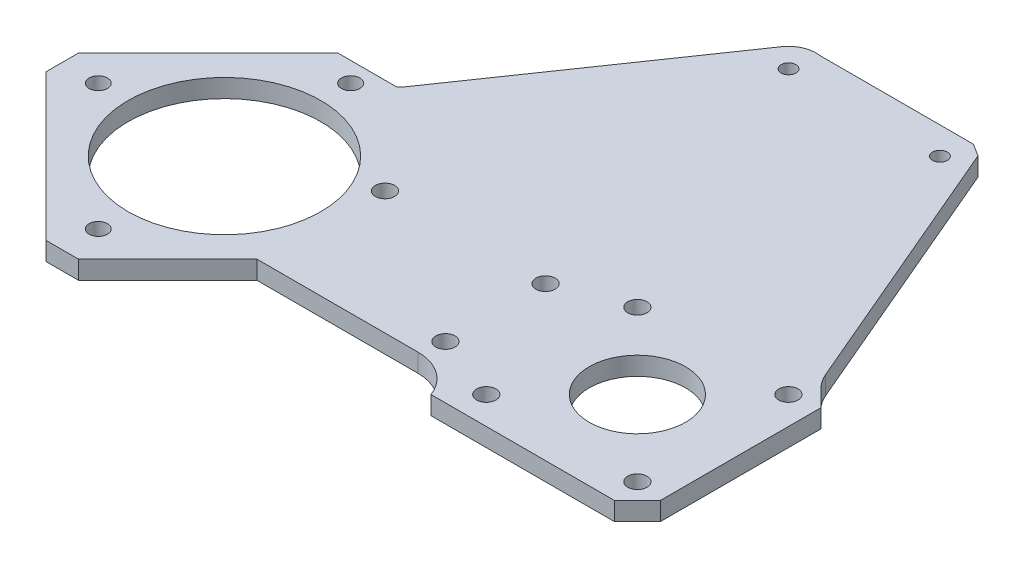
ISO-10303-21;
HEADER;
FILE_DESCRIPTION(('STEP AP214'),'2;1');
FILE_NAME('part.step','',(''),(''),'','','');
FILE_SCHEMA(('AUTOMOTIVE_DESIGN { 1 0 10303 214 1 1 1 1 }'));
ENDSEC;
DATA;
#1=APPLICATION_CONTEXT('core data for automotive mechanical design processes');
#2=APPLICATION_PROTOCOL_DEFINITION('international standard','automotive_design',2000,#1);
#3=PRODUCT_CONTEXT('',#1,'mechanical');
#4=PRODUCT('Part','Part','',(#3));
#5=PRODUCT_RELATED_PRODUCT_CATEGORY('part','',(#4));
#6=PRODUCT_DEFINITION_FORMATION('','',#4);
#7=PRODUCT_DEFINITION_CONTEXT('part definition',#1,'design');
#8=PRODUCT_DEFINITION('design','',#6,#7);
#9=PRODUCT_DEFINITION_SHAPE('','',#8);
#10=(LENGTH_UNIT() NAMED_UNIT(*) SI_UNIT(.MILLI.,.METRE.));
#11=(NAMED_UNIT(*) PLANE_ANGLE_UNIT() SI_UNIT($,.RADIAN.));
#12=(NAMED_UNIT(*) SI_UNIT($,.STERADIAN.) SOLID_ANGLE_UNIT());
#13=UNCERTAINTY_MEASURE_WITH_UNIT(LENGTH_MEASURE(1.E-05),#10,'distance_accuracy_value','');
#14=(GEOMETRIC_REPRESENTATION_CONTEXT(3) GLOBAL_UNCERTAINTY_ASSIGNED_CONTEXT((#13)) GLOBAL_UNIT_ASSIGNED_CONTEXT((#10,
#11,#12)) REPRESENTATION_CONTEXT('',''));
#15=CARTESIAN_POINT('',(0.,0.,0.));
#16=DIRECTION('',(0.,0.,1.));
#17=DIRECTION('',(1.,0.,0.));
#18=AXIS2_PLACEMENT_3D('',#15,#16,#17);
#19=CARTESIAN_POINT('',(15.9099025766975,4.,15.9099025766972));
#20=DIRECTION('',(0.,0.,-1.));
#21=DIRECTION('',(-1.,0.,0.));
#22=AXIS2_PLACEMENT_3D('',#19,#20,#21);
#23=PLANE('',#22);
#24=DIRECTION('',(0.,1.,0.));
#25=VECTOR('',#24,1.);
#26=CARTESIAN_POINT('',(22.980970388563,4.,15.9099025766972));
#27=LINE('',#26,#25);
#28=CARTESIAN_POINT('',(22.980970388563,0.,15.9099025766972));
#29=VERTEX_POINT('',#28);
#30=CARTESIAN_POINT('',(22.980970388563,4.,15.9099025766972));
#31=VERTEX_POINT('',#30);
#32=EDGE_CURVE('E11',#29,#31,#27,.T.);
#33=ORIENTED_EDGE('',*,*,#32,.F.);
#34=DIRECTION('',(1.,0.,0.));
#35=VECTOR('',#34,1.);
#36=CARTESIAN_POINT('',(15.9099025766975,0.,15.9099025766972));
#37=LINE('',#36,#35);
#38=CARTESIAN_POINT('',(58.0993317036803,0.,15.9099025766972));
#39=VERTEX_POINT('',#38);
#40=EDGE_CURVE('E314',#29,#39,#37,.T.);
#41=ORIENTED_EDGE('',*,*,#40,.T.);
#42=DIRECTION('',(0.,1.,0.));
#43=VECTOR('',#42,1.);
#44=CARTESIAN_POINT('',(58.0993317036803,4.,15.9099025766972));
#45=LINE('',#44,#43);
#46=CARTESIAN_POINT('',(58.0993317036803,4.,15.9099025766972));
#47=VERTEX_POINT('',#46);
#48=EDGE_CURVE('E350',#39,#47,#45,.T.);
#49=ORIENTED_EDGE('',*,*,#48,.T.);
#50=DIRECTION('',(1.,0.,0.));
#51=VECTOR('',#50,1.);
#52=CARTESIAN_POINT('',(15.9099025766975,4.,15.9099025766972));
#53=LINE('',#52,#51);
#54=EDGE_CURVE('E317',#31,#47,#53,.T.);
#55=ORIENTED_EDGE('',*,*,#54,.F.);
#56=EDGE_LOOP('',(#33,#41,#49,#55));
#57=FACE_BOUND('',#56,.T.);
#58=ADVANCED_FACE('F39',(#57),#23,.F.);
#59=CARTESIAN_POINT('',(-2.24690353846578,0.,-39.284271247462));
#60=DIRECTION('',(0.,1.,0.));
#61=DIRECTION('',(0.,0.,1.));
#62=AXIS2_PLACEMENT_3D('',#59,#60,#61);
#63=CYLINDRICAL_SURFACE('',#62,11.);
#64=DIRECTION('',(0.,1.,0.));
#65=VECTOR('',#64,1.);
#66=CARTESIAN_POINT('',(5.83280845705235,0.,-31.8198051533947));
#67=LINE('',#66,#65);
#68=CARTESIAN_POINT('',(5.83280845705235,0.,-31.8198051533947));
#69=VERTEX_POINT('',#68);
#70=CARTESIAN_POINT('',(5.83280845705235,4.,-31.8198051533947));
#71=VERTEX_POINT('',#70);
#72=EDGE_CURVE('E224',#69,#71,#67,.T.);
#73=ORIENTED_EDGE('',*,*,#72,.T.);
#74=CARTESIAN_POINT('',(-2.24690353846578,4.,-39.284271247462));
#75=DIRECTION('',(0.,1.,0.));
#76=DIRECTION('',(0.,0.,1.));
#77=AXIS2_PLACEMENT_3D('',#74,#75,#76);
#78=CIRCLE('',#77,11.);
#79=CARTESIAN_POINT('',(6.81409636316551,4.,-33.0474226215422));
#80=VERTEX_POINT('',#79);
#81=EDGE_CURVE('E361',#80,#71,#78,.F.);
#82=ORIENTED_EDGE('',*,*,#81,.F.);
#83=DIRECTION('',(0.,-1.,0.));
#84=VECTOR('',#83,1.);
#85=CARTESIAN_POINT('',(6.81409636316551,4.,-33.0474226215422));
#86=LINE('',#85,#84);
#87=CARTESIAN_POINT('',(6.81409636316551,0.,-33.0474226215422));
#88=VERTEX_POINT('',#87);
#89=EDGE_CURVE('E358',#88,#80,#86,.F.);
#90=ORIENTED_EDGE('',*,*,#89,.F.);
#91=CARTESIAN_POINT('',(-2.24690353846578,0.,-39.284271247462));
#92=DIRECTION('',(0.,1.,0.));
#93=DIRECTION('',(0.,0.,1.));
#94=AXIS2_PLACEMENT_3D('',#91,#92,#93);
#95=CIRCLE('',#94,11.);
#96=EDGE_CURVE('E364',#69,#88,#95,.T.);
#97=ORIENTED_EDGE('',*,*,#96,.F.);
#98=EDGE_LOOP('',(#73,#82,#90,#97));
#99=FACE_BOUND('',#98,.T.);
#100=ADVANCED_FACE('F409',(#99),#63,.F.);
#101=CARTESIAN_POINT('',(0.,4.,0.));
#102=DIRECTION('',(0.,1.,0.));
#103=DIRECTION('',(0.,0.,1.));
#104=AXIS2_PLACEMENT_3D('',#101,#102,#103);
#105=PLANE('',#104);
#106=CARTESIAN_POINT('',(0.,4.,-27.5));
#107=DIRECTION('',(0.,1.,0.));
#108=DIRECTION('',(0.,0.,1.));
#109=AXIS2_PLACEMENT_3D('',#106,#107,#108);
#110=CIRCLE('',#109,2.);
#111=CARTESIAN_POINT('',(0.,4.,-25.5));
#112=VERTEX_POINT('',#111);
#113=EDGE_CURVE('E386',#112,#112,#110,.T.);
#114=ORIENTED_EDGE('',*,*,#113,.F.);
#115=EDGE_LOOP('',(#114));
#116=FACE_BOUND('',#115,.T.);
#117=CARTESIAN_POINT('',(0.,4.,0.));
#118=DIRECTION('',(0.,1.,0.));
#119=DIRECTION('',(0.,0.,1.));
#120=AXIS2_PLACEMENT_3D('',#117,#118,#119);
#121=CIRCLE('',#120,21.);
#122=CARTESIAN_POINT('',(0.,4.,21.));
#123=VERTEX_POINT('',#122);
#124=EDGE_CURVE('E862',#123,#123,#121,.T.);
#125=ORIENTED_EDGE('',*,*,#124,.F.);
#126=EDGE_LOOP('',(#125));
#127=FACE_BOUND('',#126,.T.);
#128=CARTESIAN_POINT('',(-27.5,4.,0.));
#129=DIRECTION('',(0.,1.,0.));
#130=DIRECTION('',(0.,0.,1.));
#131=AXIS2_PLACEMENT_3D('',#128,#129,#130);
#132=CIRCLE('',#131,2.);
#133=CARTESIAN_POINT('',(-27.5,4.,2.00000000000001));
#134=VERTEX_POINT('',#133);
#135=EDGE_CURVE('E855',#134,#134,#132,.T.);
#136=ORIENTED_EDGE('',*,*,#135,.F.);
#137=EDGE_LOOP('',(#136));
#138=FACE_BOUND('',#137,.T.);
#139=CARTESIAN_POINT('',(0.,4.,27.5));
#140=DIRECTION('',(0.,1.,0.));
#141=DIRECTION('',(0.,0.,1.));
#142=AXIS2_PLACEMENT_3D('',#139,#140,#141);
#143=CIRCLE('',#142,2.);
#144=CARTESIAN_POINT('',(0.,4.,29.5));
#145=VERTEX_POINT('',#144);
#146=EDGE_CURVE('E202',#145,#145,#143,.T.);
#147=ORIENTED_EDGE('',*,*,#146,.F.);
#148=EDGE_LOOP('',(#147));
#149=FACE_BOUND('',#148,.T.);
#150=DIRECTION('',(-0.707106781186547,0.,0.707106781186548));
#151=VECTOR('',#150,1.);
#152=CARTESIAN_POINT('',(19.4454364826301,4.,19.4454364826301));
#153=LINE('',#152,#151);
#154=CARTESIAN_POINT('',(3.53553390593105,4.,35.3553390593292));
#155=VERTEX_POINT('',#154);
#156=EDGE_CURVE('E199',#31,#155,#153,.T.);
#157=ORIENTED_EDGE('',*,*,#156,.F.);
#158=ORIENTED_EDGE('',*,*,#54,.T.);
#159=CARTESIAN_POINT('',(58.0993317036803,4.,25.9099025766972));
#160=DIRECTION('',(0.,1.,0.));
#161=DIRECTION('',(0.,0.,1.));
#162=AXIS2_PLACEMENT_3D('',#159,#160,#161);
#163=CIRCLE('',#162,10.);
#164=CARTESIAN_POINT('',(67.5000000000002,4.,22.5000000000002));
#165=VERTEX_POINT('',#164);
#166=EDGE_CURVE('E356',#47,#165,#163,.F.);
#167=ORIENTED_EDGE('',*,*,#166,.T.);
#168=DIRECTION('',(1.,0.,0.));
#169=VECTOR('',#168,1.);
#170=CARTESIAN_POINT('',(67.5000000000002,4.,22.5000000000002));
#171=LINE('',#170,#169);
#172=CARTESIAN_POINT('',(107.5,4.,22.4999999999998));
#173=VERTEX_POINT('',#172);
#174=EDGE_CURVE('E319',#165,#173,#171,.T.);
#175=ORIENTED_EDGE('',*,*,#174,.T.);
#176=DIRECTION('',(-0.707106781186544,0.,0.707106781186551));
#177=VECTOR('',#176,1.);
#178=CARTESIAN_POINT('',(65.0000000000006,4.,64.9999999999999));
#179=LINE('',#178,#177);
#180=CARTESIAN_POINT('',(112.5,4.,17.4999999999998));
#181=VERTEX_POINT('',#180);
#182=EDGE_CURVE('E348',#173,#181,#179,.F.);
#183=ORIENTED_EDGE('',*,*,#182,.T.);
#184=DIRECTION('',(0.,0.,-1.));
#185=VECTOR('',#184,1.);
#186=CARTESIAN_POINT('',(112.5,4.,22.4999999999998));
#187=LINE('',#186,#185);
#188=CARTESIAN_POINT('',(112.5,4.,-17.5000000000002));
#189=VERTEX_POINT('',#188);
#190=EDGE_CURVE('E323',#181,#189,#187,.T.);
#191=ORIENTED_EDGE('',*,*,#190,.T.);
#192=DIRECTION('',(0.707106781186552,0.,0.707106781186543));
#193=VECTOR('',#192,1.);
#194=CARTESIAN_POINT('',(64.9999999999992,4.,-65.0000000000001));
#195=LINE('',#194,#193);
#196=CARTESIAN_POINT('',(108.869228748141,4.,-21.1307712518592));
#197=VERTEX_POINT('',#196);
#198=EDGE_CURVE('E346',#189,#197,#195,.F.);
#199=ORIENTED_EDGE('',*,*,#198,.T.);
#200=CARTESIAN_POINT('',(115.940296560006,4.,-28.2018390637247));
#201=DIRECTION('',(0.,1.,0.));
#202=DIRECTION('',(0.,0.,1.));
#203=AXIS2_PLACEMENT_3D('',#200,#201,#202);
#204=CIRCLE('',#203,10.);
#205=CARTESIAN_POINT('',(106.74084647912,4.,-24.2813648310234));
#206=VERTEX_POINT('',#205);
#207=EDGE_CURVE('E48',#197,#206,#204,.F.);
#208=ORIENTED_EDGE('',*,*,#207,.T.);
#209=DIRECTION('',(-0.392047423270137,0.,-0.919945008088661));
#210=VECTOR('',#209,1.);
#211=CARTESIAN_POINT('',(81.347717681448,4.,-83.8667126502187));
#212=LINE('',#211,#210);
#213=CARTESIAN_POINT('',(82.073615595106,4.,-82.1633825875402));
#214=VERTEX_POINT('',#213);
#215=EDGE_CURVE('E236',#206,#214,#212,.T.);
#216=ORIENTED_EDGE('',*,*,#215,.T.);
#217=DIRECTION('',(0.848048096156427,0.,0.529919264233203));
#218=VECTOR('',#217,1.);
#219=CARTESIAN_POINT('',(59.9714348495174,4.,-95.974357945819));
#220=LINE('',#219,#218);
#221=CARTESIAN_POINT('',(79.347717681448,4.,-83.8667126502187));
#222=VERTEX_POINT('',#221);
#223=EDGE_CURVE('E369',#214,#222,#220,.F.);
#224=ORIENTED_EDGE('',*,*,#223,.T.);
#225=DIRECTION('',(-1.,0.,0.));
#226=VECTOR('',#225,1.);
#227=CARTESIAN_POINT('',(45.949301270352,4.,-83.8667126502187));
#228=LINE('',#227,#226);
#229=CARTESIAN_POINT('',(45.949301270352,4.,-83.8667126502187));
#230=VERTEX_POINT('',#229);
#231=EDGE_CURVE('E242',#222,#230,#228,.T.);
#232=ORIENTED_EDGE('',*,*,#231,.T.);
#233=CARTESIAN_POINT('',(45.,4.,-77.9422863405995));
#234=DIRECTION('',(0.,1.,0.));
#235=DIRECTION('',(0.,0.,1.));
#236=AXIS2_PLACEMENT_3D('',#233,#234,#235);
#237=CIRCLE('',#236,6.);
#238=CARTESIAN_POINT('',(40.057636417292,4.,-81.3442037729194));
#239=VERTEX_POINT('',#238);
#240=EDGE_CURVE('E253',#230,#239,#237,.T.);
#241=ORIENTED_EDGE('',*,*,#240,.T.);
#242=DIRECTION('',(-0.566986238719982,0.,0.823727263784663));
#243=VECTOR('',#242,1.);
#244=CARTESIAN_POINT('',(3.53553390593254,4.,-28.284271247462));
#245=LINE('',#244,#243);
#246=EDGE_CURVE('E259',#239,#80,#245,.T.);
#247=ORIENTED_EDGE('',*,*,#246,.T.);
#248=ORIENTED_EDGE('',*,*,#81,.T.);
#249=DIRECTION('',(1.,0.,0.));
#250=VECTOR('',#249,1.);
#251=CARTESIAN_POINT('',(1.02664151794871E-13,4.,-31.8198051533947));
#252=LINE('',#251,#250);
#253=CARTESIAN_POINT('',(-7.07106781186567,4.,-31.8198051533947));
#254=VERTEX_POINT('',#253);
#255=EDGE_CURVE('E197',#254,#71,#252,.T.);
#256=ORIENTED_EDGE('',*,*,#255,.F.);
#257=DIRECTION('',(-0.70710678118655,0.,0.707106781186545));
#258=VECTOR('',#257,1.);
#259=CARTESIAN_POINT('',(-19.4454364826302,4.,-19.4454364826303));
#260=LINE('',#259,#258);
#261=CARTESIAN_POINT('',(-35.3553390593279,4.,-3.53553390593273));
#262=VERTEX_POINT('',#261);
#263=EDGE_CURVE('E212',#254,#262,#260,.T.);
#264=ORIENTED_EDGE('',*,*,#263,.T.);
#265=DIRECTION('',(0.,0.,1.));
#266=VECTOR('',#265,1.);
#267=CARTESIAN_POINT('',(-35.3553390593279,4.,0.));
#268=LINE('',#267,#266);
#269=CARTESIAN_POINT('',(-35.3553390593279,4.,3.53553390593269));
#270=VERTEX_POINT('',#269);
#271=EDGE_CURVE('E177',#262,#270,#268,.T.);
#272=ORIENTED_EDGE('',*,*,#271,.T.);
#273=DIRECTION('',(-0.707106781186554,0.,-0.707106781186541));
#274=VECTOR('',#273,1.);
#275=CARTESIAN_POINT('',(-19.44543648263,4.,19.4454364826303));
#276=LINE('',#275,#274);
#277=CARTESIAN_POINT('',(-3.53553390593078,4.,35.3553390593292));
#278=VERTEX_POINT('',#277);
#279=EDGE_CURVE('E215',#278,#270,#276,.T.);
#280=ORIENTED_EDGE('',*,*,#279,.F.);
#281=DIRECTION('',(1.,0.,0.));
#282=VECTOR('',#281,1.);
#283=CARTESIAN_POINT('',(6.93889390391102E-13,4.,35.3553390593291));
#284=LINE('',#283,#282);
#285=EDGE_CURVE('E218',#278,#155,#284,.T.);
#286=ORIENTED_EDGE('',*,*,#285,.T.);
#287=EDGE_LOOP('',(#157,#158,#167,#175,#183,#191,#199,#208,#216,#224,#232,#241,#247,#248,#256,
#264,#272,#280,#286));
#288=FACE_BOUND('',#287,.T.);
#289=CARTESIAN_POINT('',(78.,4.,-77.9422863405995));
#290=DIRECTION('',(0.,1.,0.));
#291=DIRECTION('',(0.,0.,1.));
#292=AXIS2_PLACEMENT_3D('',#289,#290,#291);
#293=CIRCLE('',#292,1.60000000000001);
#294=CARTESIAN_POINT('',(78.,4.,-76.3422863405995));
#295=VERTEX_POINT('',#294);
#296=EDGE_CURVE('E223',#295,#295,#293,.T.);
#297=ORIENTED_EDGE('',*,*,#296,.F.);
#298=EDGE_LOOP('',(#297));
#299=FACE_BOUND('',#298,.T.);
#300=CARTESIAN_POINT('',(45.,4.,-77.9422863405995));
#301=DIRECTION('',(0.,1.,0.));
#302=DIRECTION('',(0.,0.,1.));
#303=AXIS2_PLACEMENT_3D('',#300,#301,#302);
#304=CIRCLE('',#303,1.6);
#305=CARTESIAN_POINT('',(45.,4.,-76.3422863405995));
#306=VERTEX_POINT('',#305);
#307=EDGE_CURVE('E249',#306,#306,#304,.T.);
#308=ORIENTED_EDGE('',*,*,#307,.F.);
#309=EDGE_LOOP('',(#308));
#310=FACE_BOUND('',#309,.T.);
#311=CARTESIAN_POINT('',(90.,4.,0.));
#312=DIRECTION('',(0.,1.,0.));
#313=DIRECTION('',(0.,0.,1.));
#314=AXIS2_PLACEMENT_3D('',#311,#312,#313);
#315=CIRCLE('',#314,10.5);
#316=CARTESIAN_POINT('',(90.,4.,10.5));
#317=VERTEX_POINT('',#316);
#318=EDGE_CURVE('E311',#317,#317,#315,.T.);
#319=ORIENTED_EDGE('',*,*,#318,.F.);
#320=EDGE_LOOP('',(#319));
#321=FACE_BOUND('',#320,.T.);
#322=CARTESIAN_POINT('',(106.464466094067,4.,16.4644660940671));
#323=DIRECTION('',(0.,1.,0.));
#324=DIRECTION('',(0.,0.,1.));
#325=AXIS2_PLACEMENT_3D('',#322,#323,#324);
#326=CIRCLE('',#325,2.10000000000003);
#327=CARTESIAN_POINT('',(106.464466094067,4.,18.5644660940672));
#328=VERTEX_POINT('',#327);
#329=EDGE_CURVE('E307',#328,#328,#326,.T.);
#330=ORIENTED_EDGE('',*,*,#329,.F.);
#331=EDGE_LOOP('',(#330));
#332=FACE_BOUND('',#331,.T.);
#333=CARTESIAN_POINT('',(106.464466094067,4.,-16.4644660940674));
#334=DIRECTION('',(0.,1.,0.));
#335=DIRECTION('',(0.,0.,1.));
#336=AXIS2_PLACEMENT_3D('',#333,#334,#335);
#337=CIRCLE('',#336,2.09999999999995);
#338=CARTESIAN_POINT('',(106.464466094067,4.,-14.3644660940674));
#339=VERTEX_POINT('',#338);
#340=EDGE_CURVE('E301',#339,#339,#337,.T.);
#341=ORIENTED_EDGE('',*,*,#340,.F.);
#342=EDGE_LOOP('',(#341));
#343=FACE_BOUND('',#342,.T.);
#344=CARTESIAN_POINT('',(73.5355339059329,4.,-16.4644660940674));
#345=DIRECTION('',(0.,1.,0.));
#346=DIRECTION('',(0.,0.,1.));
#347=AXIS2_PLACEMENT_3D('',#344,#345,#346);
#348=CIRCLE('',#347,2.1);
#349=CARTESIAN_POINT('',(73.5355339059329,4.,-14.3644660940674));
#350=VERTEX_POINT('',#349);
#351=EDGE_CURVE('E295',#350,#350,#348,.T.);
#352=ORIENTED_EDGE('',*,*,#351,.F.);
#353=EDGE_LOOP('',(#352));
#354=FACE_BOUND('',#353,.T.);
#355=CARTESIAN_POINT('',(73.5355339059326,4.,16.4644660940671));
#356=DIRECTION('',(0.,1.,0.));
#357=DIRECTION('',(0.,0.,1.));
#358=AXIS2_PLACEMENT_3D('',#355,#356,#357);
#359=CIRCLE('',#358,2.1);
#360=CARTESIAN_POINT('',(73.5355339059326,4.,18.5644660940671));
#361=VERTEX_POINT('',#360);
#362=EDGE_CURVE('E289',#361,#361,#359,.T.);
#363=ORIENTED_EDGE('',*,*,#362,.F.);
#364=EDGE_LOOP('',(#363));
#365=FACE_BOUND('',#364,.T.);
#366=CARTESIAN_POINT('',(59.0756849520544,4.,10.9099025766972));
#367=DIRECTION('',(0.,1.,0.));
#368=DIRECTION('',(0.,0.,1.));
#369=AXIS2_PLACEMENT_3D('',#366,#367,#368);
#370=CIRCLE('',#369,2.1);
#371=CARTESIAN_POINT('',(59.0756849520544,4.,13.0099025766972));
#372=VERTEX_POINT('',#371);
#373=EDGE_CURVE('E283',#372,#372,#370,.T.);
#374=ORIENTED_EDGE('',*,*,#373,.F.);
#375=EDGE_LOOP('',(#374));
#376=FACE_BOUND('',#375,.T.);
#377=CARTESIAN_POINT('',(59.0756849520543,4.,-10.9099025766974));
#378=DIRECTION('',(0.,1.,0.));
#379=DIRECTION('',(0.,0.,1.));
#380=AXIS2_PLACEMENT_3D('',#377,#378,#379);
#381=CIRCLE('',#380,2.1);
#382=CARTESIAN_POINT('',(59.0756849520543,4.,-8.80990257669744));
#383=VERTEX_POINT('',#382);
#384=EDGE_CURVE('E277',#383,#383,#381,.T.);
#385=ORIENTED_EDGE('',*,*,#384,.F.);
#386=EDGE_LOOP('',(#385));
#387=FACE_BOUND('',#386,.T.);
#388=CARTESIAN_POINT('',(24.0756849520543,4.,-10.9099025766973));
#389=DIRECTION('',(0.,1.,0.));
#390=DIRECTION('',(0.,0.,1.));
#391=AXIS2_PLACEMENT_3D('',#388,#389,#390);
#392=CIRCLE('',#391,2.1);
#393=CARTESIAN_POINT('',(24.0756849520543,4.,-8.80990257669733));
#394=VERTEX_POINT('',#393);
#395=EDGE_CURVE('E271',#394,#394,#392,.T.);
#396=ORIENTED_EDGE('',*,*,#395,.F.);
#397=EDGE_LOOP('',(#396));
#398=FACE_BOUND('',#397,.T.);
#399=ADVANCED_FACE('F415',(#116,#127,#138,#149,#288,#299,#310,#321,#332,#343,#354,#365,#376,
#387,#398),#105,.T.);
#400=CARTESIAN_POINT('',(0.,0.,0.));
#401=DIRECTION('',(0.,1.,0.));
#402=DIRECTION('',(0.,0.,1.));
#403=AXIS2_PLACEMENT_3D('',#400,#401,#402);
#404=PLANE('',#403);
#405=CARTESIAN_POINT('',(0.,0.,-27.5));
#406=DIRECTION('',(0.,1.,0.));
#407=DIRECTION('',(0.,0.,1.));
#408=AXIS2_PLACEMENT_3D('',#405,#406,#407);
#409=CIRCLE('',#408,2.);
#410=CARTESIAN_POINT('',(0.,0.,-25.5));
#411=VERTEX_POINT('',#410);
#412=EDGE_CURVE('E43',#411,#411,#409,.T.);
#413=ORIENTED_EDGE('',*,*,#412,.T.);
#414=EDGE_LOOP('',(#413));
#415=FACE_BOUND('',#414,.T.);
#416=CARTESIAN_POINT('',(0.,0.,0.));
#417=DIRECTION('',(0.,1.,0.));
#418=DIRECTION('',(0.,0.,1.));
#419=AXIS2_PLACEMENT_3D('',#416,#417,#418);
#420=CIRCLE('',#419,21.);
#421=CARTESIAN_POINT('',(0.,0.,21.));
#422=VERTEX_POINT('',#421);
#423=EDGE_CURVE('E388',#422,#422,#420,.T.);
#424=ORIENTED_EDGE('',*,*,#423,.T.);
#425=EDGE_LOOP('',(#424));
#426=FACE_BOUND('',#425,.T.);
#427=CARTESIAN_POINT('',(-27.5,0.,0.));
#428=DIRECTION('',(0.,1.,0.));
#429=DIRECTION('',(0.,0.,1.));
#430=AXIS2_PLACEMENT_3D('',#427,#428,#429);
#431=CIRCLE('',#430,2.);
#432=CARTESIAN_POINT('',(-27.5,0.,2.00000000000001));
#433=VERTEX_POINT('',#432);
#434=EDGE_CURVE('E385',#433,#433,#431,.T.);
#435=ORIENTED_EDGE('',*,*,#434,.T.);
#436=EDGE_LOOP('',(#435));
#437=FACE_BOUND('',#436,.T.);
#438=CARTESIAN_POINT('',(0.,0.,27.5));
#439=DIRECTION('',(0.,1.,0.));
#440=DIRECTION('',(0.,0.,1.));
#441=AXIS2_PLACEMENT_3D('',#438,#439,#440);
#442=CIRCLE('',#441,2.);
#443=CARTESIAN_POINT('',(0.,0.,29.5));
#444=VERTEX_POINT('',#443);
#445=EDGE_CURVE('E382',#444,#444,#442,.T.);
#446=ORIENTED_EDGE('',*,*,#445,.T.);
#447=EDGE_LOOP('',(#446));
#448=FACE_BOUND('',#447,.T.);
#449=DIRECTION('',(1.,0.,0.));
#450=VECTOR('',#449,1.);
#451=CARTESIAN_POINT('',(1.02664151794871E-13,0.,-31.8198051533947));
#452=LINE('',#451,#450);
#453=CARTESIAN_POINT('',(-7.07106781186567,0.,-31.8198051533947));
#454=VERTEX_POINT('',#453);
#455=EDGE_CURVE('E183',#454,#69,#452,.T.);
#456=ORIENTED_EDGE('',*,*,#455,.T.);
#457=ORIENTED_EDGE('',*,*,#96,.T.);
#458=DIRECTION('',(-0.566986238719982,0.,0.823727263784663));
#459=VECTOR('',#458,1.);
#460=CARTESIAN_POINT('',(3.53553390593254,0.,-28.284271247462));
#461=LINE('',#460,#459);
#462=CARTESIAN_POINT('',(40.057636417292,0.,-81.3442037729194));
#463=VERTEX_POINT('',#462);
#464=EDGE_CURVE('E258',#463,#88,#461,.T.);
#465=ORIENTED_EDGE('',*,*,#464,.F.);
#466=CARTESIAN_POINT('',(45.,0.,-77.9422863405995));
#467=DIRECTION('',(0.,1.,0.));
#468=DIRECTION('',(0.,0.,1.));
#469=AXIS2_PLACEMENT_3D('',#466,#467,#468);
#470=CIRCLE('',#469,6.);
#471=CARTESIAN_POINT('',(45.949301270352,0.,-83.8667126502187));
#472=VERTEX_POINT('',#471);
#473=EDGE_CURVE('E256',#472,#463,#470,.T.);
#474=ORIENTED_EDGE('',*,*,#473,.F.);
#475=DIRECTION('',(-1.,0.,0.));
#476=VECTOR('',#475,1.);
#477=CARTESIAN_POINT('',(45.949301270352,0.,-83.8667126502187));
#478=LINE('',#477,#476);
#479=CARTESIAN_POINT('',(79.347717681448,0.,-83.8667126502187));
#480=VERTEX_POINT('',#479);
#481=EDGE_CURVE('E241',#480,#472,#478,.T.);
#482=ORIENTED_EDGE('',*,*,#481,.F.);
#483=DIRECTION('',(-0.848048096156427,0.,-0.529919264233203));
#484=VECTOR('',#483,1.);
#485=CARTESIAN_POINT('',(82.073615595106,0.,-82.1633825875402));
#486=LINE('',#485,#484);
#487=CARTESIAN_POINT('',(82.073615595106,0.,-82.1633825875402));
#488=VERTEX_POINT('',#487);
#489=EDGE_CURVE('E373',#480,#488,#486,.F.);
#490=ORIENTED_EDGE('',*,*,#489,.T.);
#491=DIRECTION('',(-0.392047423270137,0.,-0.919945008088661));
#492=VECTOR('',#491,1.);
#493=CARTESIAN_POINT('',(81.347717681448,0.,-83.8667126502187));
#494=LINE('',#493,#492);
#495=CARTESIAN_POINT('',(106.74084647912,0.,-24.2813648310234));
#496=VERTEX_POINT('',#495);
#497=EDGE_CURVE('E239',#496,#488,#494,.T.);
#498=ORIENTED_EDGE('',*,*,#497,.F.);
#499=CARTESIAN_POINT('',(115.940296560006,0.,-28.2018390637247));
#500=DIRECTION('',(0.,1.,0.));
#501=DIRECTION('',(0.,0.,1.));
#502=AXIS2_PLACEMENT_3D('',#499,#500,#501);
#503=CIRCLE('',#502,10.);
#504=CARTESIAN_POINT('',(108.869228748141,0.,-21.1307712518592));
#505=VERTEX_POINT('',#504);
#506=EDGE_CURVE('E56',#496,#505,#503,.T.);
#507=ORIENTED_EDGE('',*,*,#506,.T.);
#508=DIRECTION('',(-0.707106781186552,0.,-0.707106781186543));
#509=VECTOR('',#508,1.);
#510=CARTESIAN_POINT('',(107.5,0.,-22.5000000000002));
#511=LINE('',#510,#509);
#512=CARTESIAN_POINT('',(112.5,0.,-17.5000000000002));
#513=VERTEX_POINT('',#512);
#514=EDGE_CURVE('E340',#505,#513,#511,.F.);
#515=ORIENTED_EDGE('',*,*,#514,.T.);
#516=DIRECTION('',(0.,0.,-1.));
#517=VECTOR('',#516,1.);
#518=CARTESIAN_POINT('',(112.5,0.,22.4999999999998));
#519=LINE('',#518,#517);
#520=CARTESIAN_POINT('',(112.5,0.,17.4999999999998));
#521=VERTEX_POINT('',#520);
#522=EDGE_CURVE('E320',#521,#513,#519,.T.);
#523=ORIENTED_EDGE('',*,*,#522,.F.);
#524=DIRECTION('',(0.707106781186544,0.,-0.707106781186551));
#525=VECTOR('',#524,1.);
#526=CARTESIAN_POINT('',(112.5,0.,17.4999999999998));
#527=LINE('',#526,#525);
#528=CARTESIAN_POINT('',(107.5,0.,22.4999999999998));
#529=VERTEX_POINT('',#528);
#530=EDGE_CURVE('E342',#521,#529,#527,.F.);
#531=ORIENTED_EDGE('',*,*,#530,.T.);
#532=DIRECTION('',(1.,0.,0.));
#533=VECTOR('',#532,1.);
#534=CARTESIAN_POINT('',(67.5000000000002,0.,22.5000000000002));
#535=LINE('',#534,#533);
#536=CARTESIAN_POINT('',(67.5000000000002,0.,22.5000000000002));
#537=VERTEX_POINT('',#536);
#538=EDGE_CURVE('E328',#537,#529,#535,.T.);
#539=ORIENTED_EDGE('',*,*,#538,.F.);
#540=CARTESIAN_POINT('',(58.0993317036803,0.,25.9099025766972));
#541=DIRECTION('',(0.,1.,0.));
#542=DIRECTION('',(0.,0.,1.));
#543=AXIS2_PLACEMENT_3D('',#540,#541,#542);
#544=CIRCLE('',#543,10.);
#545=EDGE_CURVE('E353',#537,#39,#544,.T.);
#546=ORIENTED_EDGE('',*,*,#545,.T.);
#547=ORIENTED_EDGE('',*,*,#40,.F.);
#548=DIRECTION('',(-0.707106781186547,0.,0.707106781186548));
#549=VECTOR('',#548,1.);
#550=CARTESIAN_POINT('',(19.4454364826301,0.,19.4454364826301));
#551=LINE('',#550,#549);
#552=CARTESIAN_POINT('',(3.53553390593105,0.,35.3553390593292));
#553=VERTEX_POINT('',#552);
#554=EDGE_CURVE('E209',#29,#553,#551,.T.);
#555=ORIENTED_EDGE('',*,*,#554,.T.);
#556=DIRECTION('',(1.,0.,0.));
#557=VECTOR('',#556,1.);
#558=CARTESIAN_POINT('',(6.93889390391102E-13,0.,35.3553390593291));
#559=LINE('',#558,#557);
#560=CARTESIAN_POINT('',(-3.53553390593078,0.,35.3553390593292));
#561=VERTEX_POINT('',#560);
#562=EDGE_CURVE('E206',#561,#553,#559,.T.);
#563=ORIENTED_EDGE('',*,*,#562,.F.);
#564=DIRECTION('',(-0.707106781186554,0.,-0.707106781186541));
#565=VECTOR('',#564,1.);
#566=CARTESIAN_POINT('',(-19.44543648263,0.,19.4454364826303));
#567=LINE('',#566,#565);
#568=CARTESIAN_POINT('',(-35.3553390593279,0.,3.53553390593269));
#569=VERTEX_POINT('',#568);
#570=EDGE_CURVE('E191',#561,#569,#567,.T.);
#571=ORIENTED_EDGE('',*,*,#570,.T.);
#572=DIRECTION('',(0.,0.,1.));
#573=VECTOR('',#572,1.);
#574=CARTESIAN_POINT('',(-35.3553390593279,0.,0.));
#575=LINE('',#574,#573);
#576=CARTESIAN_POINT('',(-35.3553390593279,0.,-3.53553390593273));
#577=VERTEX_POINT('',#576);
#578=EDGE_CURVE('E175',#577,#569,#575,.T.);
#579=ORIENTED_EDGE('',*,*,#578,.F.);
#580=DIRECTION('',(-0.70710678118655,0.,0.707106781186545));
#581=VECTOR('',#580,1.);
#582=CARTESIAN_POINT('',(-19.4454364826302,0.,-19.4454364826303));
#583=LINE('',#582,#581);
#584=EDGE_CURVE('E188',#454,#577,#583,.T.);
#585=ORIENTED_EDGE('',*,*,#584,.F.);
#586=EDGE_LOOP('',(#456,#457,#465,#474,#482,#490,#498,#507,#515,#523,#531,#539,#546,#547,#555,
#563,#571,#579,#585));
#587=FACE_BOUND('',#586,.T.);
#588=CARTESIAN_POINT('',(78.,0.,-77.9422863405995));
#589=DIRECTION('',(0.,1.,0.));
#590=DIRECTION('',(0.,0.,1.));
#591=AXIS2_PLACEMENT_3D('',#588,#589,#590);
#592=CIRCLE('',#591,1.60000000000001);
#593=CARTESIAN_POINT('',(78.,0.,-76.3422863405995));
#594=VERTEX_POINT('',#593);
#595=EDGE_CURVE('E233',#594,#594,#592,.T.);
#596=ORIENTED_EDGE('',*,*,#595,.T.);
#597=EDGE_LOOP('',(#596));
#598=FACE_BOUND('',#597,.T.);
#599=CARTESIAN_POINT('',(45.,0.,-77.9422863405995));
#600=DIRECTION('',(0.,1.,0.));
#601=DIRECTION('',(0.,0.,1.));
#602=AXIS2_PLACEMENT_3D('',#599,#600,#601);
#603=CIRCLE('',#602,1.6);
#604=CARTESIAN_POINT('',(45.,0.,-76.3422863405995));
#605=VERTEX_POINT('',#604);
#606=EDGE_CURVE('E250',#605,#605,#603,.T.);
#607=ORIENTED_EDGE('',*,*,#606,.T.);
#608=EDGE_LOOP('',(#607));
#609=FACE_BOUND('',#608,.T.);
#610=CARTESIAN_POINT('',(90.,0.,0.));
#611=DIRECTION('',(0.,1.,0.));
#612=DIRECTION('',(0.,0.,1.));
#613=AXIS2_PLACEMENT_3D('',#610,#611,#612);
#614=CIRCLE('',#613,10.5);
#615=CARTESIAN_POINT('',(90.,0.,10.5));
#616=VERTEX_POINT('',#615);
#617=EDGE_CURVE('E310',#616,#616,#614,.T.);
#618=ORIENTED_EDGE('',*,*,#617,.T.);
#619=EDGE_LOOP('',(#618));
#620=FACE_BOUND('',#619,.T.);
#621=CARTESIAN_POINT('',(106.464466094067,0.,16.4644660940671));
#622=DIRECTION('',(0.,-1.,0.));
#623=DIRECTION('',(0.,0.,-1.));
#624=AXIS2_PLACEMENT_3D('',#621,#622,#623);
#625=CIRCLE('',#624,2.10000000000003);
#626=CARTESIAN_POINT('',(106.464466094067,0.,14.3644660940671));
#627=VERTEX_POINT('',#626);
#628=EDGE_CURVE('E304',#627,#627,#625,.T.);
#629=ORIENTED_EDGE('',*,*,#628,.F.);
#630=EDGE_LOOP('',(#629));
#631=FACE_BOUND('',#630,.T.);
#632=CARTESIAN_POINT('',(106.464466094067,0.,-16.4644660940674));
#633=DIRECTION('',(0.,-1.,0.));
#634=DIRECTION('',(0.,0.,-1.));
#635=AXIS2_PLACEMENT_3D('',#632,#633,#634);
#636=CIRCLE('',#635,2.09999999999995);
#637=CARTESIAN_POINT('',(106.464466094067,0.,-18.5644660940673));
#638=VERTEX_POINT('',#637);
#639=EDGE_CURVE('E298',#638,#638,#636,.T.);
#640=ORIENTED_EDGE('',*,*,#639,.F.);
#641=EDGE_LOOP('',(#640));
#642=FACE_BOUND('',#641,.T.);
#643=CARTESIAN_POINT('',(73.5355339059329,0.,-16.4644660940674));
#644=DIRECTION('',(0.,-1.,0.));
#645=DIRECTION('',(0.,0.,1.));
#646=AXIS2_PLACEMENT_3D('',#643,#644,#645);
#647=CIRCLE('',#646,2.1);
#648=CARTESIAN_POINT('',(73.5355339059329,0.,-14.3644660940674));
#649=VERTEX_POINT('',#648);
#650=EDGE_CURVE('E292',#649,#649,#647,.T.);
#651=ORIENTED_EDGE('',*,*,#650,.F.);
#652=EDGE_LOOP('',(#651));
#653=FACE_BOUND('',#652,.T.);
#654=CARTESIAN_POINT('',(73.5355339059326,0.,16.4644660940671));
#655=DIRECTION('',(0.,-1.,0.));
#656=DIRECTION('',(0.,0.,1.));
#657=AXIS2_PLACEMENT_3D('',#654,#655,#656);
#658=CIRCLE('',#657,2.1);
#659=CARTESIAN_POINT('',(73.5355339059326,0.,18.5644660940671));
#660=VERTEX_POINT('',#659);
#661=EDGE_CURVE('E286',#660,#660,#658,.T.);
#662=ORIENTED_EDGE('',*,*,#661,.F.);
#663=EDGE_LOOP('',(#662));
#664=FACE_BOUND('',#663,.T.);
#665=CARTESIAN_POINT('',(59.0756849520544,0.,10.9099025766972));
#666=DIRECTION('',(0.,-1.,0.));
#667=DIRECTION('',(0.,0.,-1.));
#668=AXIS2_PLACEMENT_3D('',#665,#666,#667);
#669=CIRCLE('',#668,2.1);
#670=CARTESIAN_POINT('',(59.0756849520544,0.,8.80990257669725));
#671=VERTEX_POINT('',#670);
#672=EDGE_CURVE('E280',#671,#671,#669,.T.);
#673=ORIENTED_EDGE('',*,*,#672,.F.);
#674=EDGE_LOOP('',(#673));
#675=FACE_BOUND('',#674,.T.);
#676=CARTESIAN_POINT('',(59.0756849520543,0.,-10.9099025766974));
#677=DIRECTION('',(0.,-1.,0.));
#678=DIRECTION('',(0.,0.,1.));
#679=AXIS2_PLACEMENT_3D('',#676,#677,#678);
#680=CIRCLE('',#679,2.1);
#681=CARTESIAN_POINT('',(59.0756849520543,0.,-8.80990257669744));
#682=VERTEX_POINT('',#681);
#683=EDGE_CURVE('E274',#682,#682,#680,.T.);
#684=ORIENTED_EDGE('',*,*,#683,.F.);
#685=EDGE_LOOP('',(#684));
#686=FACE_BOUND('',#685,.T.);
#687=CARTESIAN_POINT('',(24.0756849520543,0.,-10.9099025766973));
#688=DIRECTION('',(0.,-1.,0.));
#689=DIRECTION('',(0.,0.,1.));
#690=AXIS2_PLACEMENT_3D('',#687,#688,#689);
#691=CIRCLE('',#690,2.1);
#692=CARTESIAN_POINT('',(24.0756849520543,0.,-8.80990257669733));
#693=VERTEX_POINT('',#692);
#694=EDGE_CURVE('E268',#693,#693,#691,.T.);
#695=ORIENTED_EDGE('',*,*,#694,.F.);
#696=EDGE_LOOP('',(#695));
#697=FACE_BOUND('',#696,.T.);
#698=ADVANCED_FACE('F186',(#415,#426,#437,#448,#587,#598,#609,#620,#631,#642,#653,#664,#675,
#686,#697),#404,.F.);
#699=CARTESIAN_POINT('',(67.5000000000002,4.,22.5000000000002));
#700=DIRECTION('',(0.,0.,-1.));
#701=DIRECTION('',(-1.,0.,0.));
#702=AXIS2_PLACEMENT_3D('',#699,#700,#701);
#703=PLANE('',#702);
#704=ORIENTED_EDGE('',*,*,#538,.T.);
#705=DIRECTION('',(0.,1.,0.));
#706=VECTOR('',#705,1.);
#707=CARTESIAN_POINT('',(107.5,4.,22.4999999999998));
#708=LINE('',#707,#706);
#709=EDGE_CURVE('E344',#529,#173,#708,.T.);
#710=ORIENTED_EDGE('',*,*,#709,.T.);
#711=ORIENTED_EDGE('',*,*,#174,.F.);
#712=DIRECTION('',(0.,-1.,0.));
#713=VECTOR('',#712,1.);
#714=CARTESIAN_POINT('',(67.5000000000002,4.,22.5000000000002));
#715=LINE('',#714,#713);
#716=EDGE_CURVE('E326',#165,#537,#715,.T.);
#717=ORIENTED_EDGE('',*,*,#716,.T.);
#718=EDGE_LOOP('',(#704,#710,#711,#717));
#719=FACE_BOUND('',#718,.T.);
#720=ADVANCED_FACE('F421',(#719),#703,.F.);
#721=CARTESIAN_POINT('',(112.5,4.,22.4999999999998));
#722=DIRECTION('',(-1.,0.,0.));
#723=DIRECTION('',(0.,0.,1.));
#724=AXIS2_PLACEMENT_3D('',#721,#722,#723);
#725=PLANE('',#724);
#726=ORIENTED_EDGE('',*,*,#190,.F.);
#727=DIRECTION('',(0.,-1.,0.));
#728=VECTOR('',#727,1.);
#729=CARTESIAN_POINT('',(112.5,4.,17.4999999999998));
#730=LINE('',#729,#728);
#731=EDGE_CURVE('E337',#181,#521,#730,.T.);
#732=ORIENTED_EDGE('',*,*,#731,.T.);
#733=ORIENTED_EDGE('',*,*,#522,.T.);
#734=DIRECTION('',(0.,1.,0.));
#735=VECTOR('',#734,1.);
#736=CARTESIAN_POINT('',(112.5,4.,-17.5000000000002));
#737=LINE('',#736,#735);
#738=EDGE_CURVE('E335',#513,#189,#737,.T.);
#739=ORIENTED_EDGE('',*,*,#738,.T.);
#740=EDGE_LOOP('',(#726,#732,#733,#739));
#741=FACE_BOUND('',#740,.T.);
#742=ADVANCED_FACE('F473',(#741),#725,.F.);
#743=CARTESIAN_POINT('',(90.,4.,0.));
#744=DIRECTION('',(0.,-1.,0.));
#745=DIRECTION('',(0.,0.,-1.));
#746=AXIS2_PLACEMENT_3D('',#743,#744,#745);
#747=CYLINDRICAL_SURFACE('',#746,10.5);
#748=ORIENTED_EDGE('',*,*,#318,.T.);
#749=EDGE_LOOP('',(#748));
#750=FACE_BOUND('',#749,.T.);
#751=ORIENTED_EDGE('',*,*,#617,.F.);
#752=EDGE_LOOP('',(#751));
#753=FACE_BOUND('',#752,.T.);
#754=ADVANCED_FACE('F427',(#750,#753),#747,.F.);
#755=CARTESIAN_POINT('',(112.5,4.,17.4999999999998));
#756=DIRECTION('',(-0.707106781186551,0.,-0.707106781186543));
#757=DIRECTION('',(0.,-1.,0.));
#758=AXIS2_PLACEMENT_3D('',#755,#756,#757);
#759=PLANE('',#758);
#760=ORIENTED_EDGE('',*,*,#182,.F.);
#761=ORIENTED_EDGE('',*,*,#709,.F.);
#762=ORIENTED_EDGE('',*,*,#530,.F.);
#763=ORIENTED_EDGE('',*,*,#731,.F.);
#764=EDGE_LOOP('',(#760,#761,#762,#763));
#765=FACE_BOUND('',#764,.T.);
#766=ADVANCED_FACE('F423',(#765),#759,.F.);
#767=CARTESIAN_POINT('',(107.5,4.,-22.5000000000002));
#768=DIRECTION('',(-0.707106781186543,0.,0.707106781186552));
#769=DIRECTION('',(0.,-1.,0.));
#770=AXIS2_PLACEMENT_3D('',#767,#768,#769);
#771=PLANE('',#770);
#772=ORIENTED_EDGE('',*,*,#514,.F.);
#773=DIRECTION('',(0.,-1.,0.));
#774=VECTOR('',#773,1.);
#775=CARTESIAN_POINT('',(108.869228748141,4.,-21.1307712518592));
#776=LINE('',#775,#774);
#777=EDGE_CURVE('E63',#505,#197,#776,.F.);
#778=ORIENTED_EDGE('',*,*,#777,.T.);
#779=ORIENTED_EDGE('',*,*,#198,.F.);
#780=ORIENTED_EDGE('',*,*,#738,.F.);
#781=EDGE_LOOP('',(#772,#778,#779,#780));
#782=FACE_BOUND('',#781,.T.);
#783=ADVANCED_FACE('F426',(#782),#771,.F.);
#784=CARTESIAN_POINT('',(58.0993317036803,4.,25.9099025766972));
#785=DIRECTION('',(0.,1.,0.));
#786=DIRECTION('',(0.,0.,1.));
#787=AXIS2_PLACEMENT_3D('',#784,#785,#786);
#788=CYLINDRICAL_SURFACE('',#787,10.);
#789=ORIENTED_EDGE('',*,*,#166,.F.);
#790=ORIENTED_EDGE('',*,*,#48,.F.);
#791=ORIENTED_EDGE('',*,*,#545,.F.);
#792=ORIENTED_EDGE('',*,*,#716,.F.);
#793=EDGE_LOOP('',(#789,#790,#791,#792));
#794=FACE_BOUND('',#793,.T.);
#795=ADVANCED_FACE('F431',(#794),#788,.F.);
#796=CARTESIAN_POINT('',(106.464466094067,10.,16.4644660940671));
#797=DIRECTION('',(0.,-1.,0.));
#798=DIRECTION('',(0.,0.,-1.));
#799=AXIS2_PLACEMENT_3D('',#796,#797,#798);
#800=CYLINDRICAL_SURFACE('',#799,2.10000000000003);
#801=ORIENTED_EDGE('',*,*,#329,.T.);
#802=EDGE_LOOP('',(#801));
#803=FACE_BOUND('',#802,.T.);
#804=ORIENTED_EDGE('',*,*,#628,.T.);
#805=EDGE_LOOP('',(#804));
#806=FACE_BOUND('',#805,.T.);
#807=ADVANCED_FACE('F433',(#803,#806),#800,.F.);
#808=CARTESIAN_POINT('',(106.464466094067,10.,-16.4644660940674));
#809=DIRECTION('',(0.,-1.,0.));
#810=DIRECTION('',(0.,0.,-1.));
#811=AXIS2_PLACEMENT_3D('',#808,#809,#810);
#812=CYLINDRICAL_SURFACE('',#811,2.09999999999995);
#813=ORIENTED_EDGE('',*,*,#340,.T.);
#814=EDGE_LOOP('',(#813));
#815=FACE_BOUND('',#814,.T.);
#816=ORIENTED_EDGE('',*,*,#639,.T.);
#817=EDGE_LOOP('',(#816));
#818=FACE_BOUND('',#817,.T.);
#819=ADVANCED_FACE('F532',(#815,#818),#812,.F.);
#820=CARTESIAN_POINT('',(73.5355339059329,10.,-16.4644660940674));
#821=DIRECTION('',(0.,-1.,0.));
#822=DIRECTION('',(0.,0.,-1.));
#823=AXIS2_PLACEMENT_3D('',#820,#821,#822);
#824=CYLINDRICAL_SURFACE('',#823,2.1);
#825=ORIENTED_EDGE('',*,*,#351,.T.);
#826=EDGE_LOOP('',(#825));
#827=FACE_BOUND('',#826,.T.);
#828=ORIENTED_EDGE('',*,*,#650,.T.);
#829=EDGE_LOOP('',(#828));
#830=FACE_BOUND('',#829,.T.);
#831=ADVANCED_FACE('F528',(#827,#830),#824,.F.);
#832=CARTESIAN_POINT('',(73.5355339059326,10.,16.4644660940671));
#833=DIRECTION('',(0.,-1.,0.));
#834=DIRECTION('',(0.,0.,-1.));
#835=AXIS2_PLACEMENT_3D('',#832,#833,#834);
#836=CYLINDRICAL_SURFACE('',#835,2.1);
#837=ORIENTED_EDGE('',*,*,#362,.T.);
#838=EDGE_LOOP('',(#837));
#839=FACE_BOUND('',#838,.T.);
#840=ORIENTED_EDGE('',*,*,#661,.T.);
#841=EDGE_LOOP('',(#840));
#842=FACE_BOUND('',#841,.T.);
#843=ADVANCED_FACE('F524',(#839,#842),#836,.F.);
#844=CARTESIAN_POINT('',(59.0756849520544,10.,10.9099025766972));
#845=DIRECTION('',(0.,-1.,0.));
#846=DIRECTION('',(0.,0.,-1.));
#847=AXIS2_PLACEMENT_3D('',#844,#845,#846);
#848=CYLINDRICAL_SURFACE('',#847,2.1);
#849=ORIENTED_EDGE('',*,*,#373,.T.);
#850=EDGE_LOOP('',(#849));
#851=FACE_BOUND('',#850,.T.);
#852=ORIENTED_EDGE('',*,*,#672,.T.);
#853=EDGE_LOOP('',(#852));
#854=FACE_BOUND('',#853,.T.);
#855=ADVANCED_FACE('F520',(#851,#854),#848,.F.);
#856=CARTESIAN_POINT('',(59.0756849520543,10.,-10.9099025766974));
#857=DIRECTION('',(0.,-1.,0.));
#858=DIRECTION('',(0.,0.,-1.));
#859=AXIS2_PLACEMENT_3D('',#856,#857,#858);
#860=CYLINDRICAL_SURFACE('',#859,2.1);
#861=ORIENTED_EDGE('',*,*,#384,.T.);
#862=EDGE_LOOP('',(#861));
#863=FACE_BOUND('',#862,.T.);
#864=ORIENTED_EDGE('',*,*,#683,.T.);
#865=EDGE_LOOP('',(#864));
#866=FACE_BOUND('',#865,.T.);
#867=ADVANCED_FACE('F512',(#863,#866),#860,.F.);
#868=CARTESIAN_POINT('',(24.0756849520543,10.,-10.9099025766973));
#869=DIRECTION('',(0.,-1.,0.));
#870=DIRECTION('',(0.,0.,-1.));
#871=AXIS2_PLACEMENT_3D('',#868,#869,#870);
#872=CYLINDRICAL_SURFACE('',#871,2.1);
#873=ORIENTED_EDGE('',*,*,#395,.T.);
#874=EDGE_LOOP('',(#873));
#875=FACE_BOUND('',#874,.T.);
#876=ORIENTED_EDGE('',*,*,#694,.T.);
#877=EDGE_LOOP('',(#876));
#878=FACE_BOUND('',#877,.T.);
#879=ADVANCED_FACE('F504',(#875,#878),#872,.F.);
#880=CARTESIAN_POINT('',(3.53553390593254,0.,-28.284271247462));
#881=DIRECTION('',(-0.823727263784663,0.,-0.566986238719982));
#882=DIRECTION('',(-0.566986238719982,0.,0.823727263784663));
#883=AXIS2_PLACEMENT_3D('',#880,#881,#882);
#884=PLANE('',#883);
#885=ORIENTED_EDGE('',*,*,#464,.T.);
#886=ORIENTED_EDGE('',*,*,#89,.T.);
#887=ORIENTED_EDGE('',*,*,#246,.F.);
#888=DIRECTION('',(0.,1.,0.));
#889=VECTOR('',#888,1.);
#890=CARTESIAN_POINT('',(40.057636417292,0.,-81.3442037729194));
#891=LINE('',#890,#889);
#892=EDGE_CURVE('E262',#463,#239,#891,.T.);
#893=ORIENTED_EDGE('',*,*,#892,.F.);
#894=EDGE_LOOP('',(#885,#886,#887,#893));
#895=FACE_BOUND('',#894,.T.);
#896=ADVANCED_FACE('F502',(#895),#884,.T.);
#897=CARTESIAN_POINT('',(45.,0.,-77.9422863405995));
#898=DIRECTION('',(0.,1.,0.));
#899=DIRECTION('',(0.,0.,1.));
#900=AXIS2_PLACEMENT_3D('',#897,#898,#899);
#901=CYLINDRICAL_SURFACE('',#900,6.);
#902=DIRECTION('',(0.,1.,0.));
#903=VECTOR('',#902,1.);
#904=CARTESIAN_POINT('',(45.949301270352,0.,-83.8667126502187));
#905=LINE('',#904,#903);
#906=EDGE_CURVE('E244',#472,#230,#905,.T.);
#907=ORIENTED_EDGE('',*,*,#906,.F.);
#908=ORIENTED_EDGE('',*,*,#473,.T.);
#909=ORIENTED_EDGE('',*,*,#892,.T.);
#910=ORIENTED_EDGE('',*,*,#240,.F.);
#911=EDGE_LOOP('',(#907,#908,#909,#910));
#912=FACE_BOUND('',#911,.T.);
#913=ADVANCED_FACE('F460',(#912),#901,.T.);
#914=CARTESIAN_POINT('',(45.,0.,-77.9422863405995));
#915=DIRECTION('',(0.,1.,0.));
#916=DIRECTION('',(0.,0.,1.));
#917=AXIS2_PLACEMENT_3D('',#914,#915,#916);
#918=CYLINDRICAL_SURFACE('',#917,1.6);
#919=ORIENTED_EDGE('',*,*,#606,.F.);
#920=EDGE_LOOP('',(#919));
#921=FACE_BOUND('',#920,.T.);
#922=ORIENTED_EDGE('',*,*,#307,.T.);
#923=EDGE_LOOP('',(#922));
#924=FACE_BOUND('',#923,.T.);
#925=ADVANCED_FACE('F510',(#921,#924),#918,.F.);
#926=CARTESIAN_POINT('',(45.949301270352,0.,-83.8667126502187));
#927=DIRECTION('',(0.,0.,-1.));
#928=DIRECTION('',(-1.,0.,0.));
#929=AXIS2_PLACEMENT_3D('',#926,#927,#928);
#930=PLANE('',#929);
#931=ORIENTED_EDGE('',*,*,#231,.F.);
#932=DIRECTION('',(0.,-1.,0.));
#933=VECTOR('',#932,1.);
#934=CARTESIAN_POINT('',(79.347717681448,0.,-83.8667126502187));
#935=LINE('',#934,#933);
#936=EDGE_CURVE('E371',#222,#480,#935,.T.);
#937=ORIENTED_EDGE('',*,*,#936,.T.);
#938=ORIENTED_EDGE('',*,*,#481,.T.);
#939=ORIENTED_EDGE('',*,*,#906,.T.);
#940=EDGE_LOOP('',(#931,#937,#938,#939));
#941=FACE_BOUND('',#940,.T.);
#942=ADVANCED_FACE('F457',(#941),#930,.T.);
#943=CARTESIAN_POINT('',(81.347717681448,0.,-83.8667126502187));
#944=DIRECTION('',(0.919945008088661,0.,-0.392047423270137));
#945=DIRECTION('',(-0.392047423270137,0.,-0.919945008088661));
#946=AXIS2_PLACEMENT_3D('',#943,#944,#945);
#947=PLANE('',#946);
#948=ORIENTED_EDGE('',*,*,#215,.F.);
#949=DIRECTION('',(0.,1.,0.));
#950=VECTOR('',#949,1.);
#951=CARTESIAN_POINT('',(106.74084647912,0.,-24.2813648310234));
#952=LINE('',#951,#950);
#953=EDGE_CURVE('E376',#206,#496,#952,.F.);
#954=ORIENTED_EDGE('',*,*,#953,.T.);
#955=ORIENTED_EDGE('',*,*,#497,.T.);
#956=DIRECTION('',(0.,1.,0.));
#957=VECTOR('',#956,1.);
#958=CARTESIAN_POINT('',(82.073615595106,0.,-82.1633825875402));
#959=LINE('',#958,#957);
#960=EDGE_CURVE('E366',#488,#214,#959,.T.);
#961=ORIENTED_EDGE('',*,*,#960,.T.);
#962=EDGE_LOOP('',(#948,#954,#955,#961));
#963=FACE_BOUND('',#962,.T.);
#964=ADVANCED_FACE('F444',(#963),#947,.T.);
#965=CARTESIAN_POINT('',(78.,0.,-77.9422863405995));
#966=DIRECTION('',(0.,1.,0.));
#967=DIRECTION('',(0.,0.,1.));
#968=AXIS2_PLACEMENT_3D('',#965,#966,#967);
#969=CYLINDRICAL_SURFACE('',#968,1.60000000000001);
#970=ORIENTED_EDGE('',*,*,#595,.F.);
#971=EDGE_LOOP('',(#970));
#972=FACE_BOUND('',#971,.T.);
#973=ORIENTED_EDGE('',*,*,#296,.T.);
#974=EDGE_LOOP('',(#973));
#975=FACE_BOUND('',#974,.T.);
#976=ADVANCED_FACE('F437',(#972,#975),#969,.F.);
#977=CARTESIAN_POINT('',(82.073615595106,0.,-82.1633825875402));
#978=DIRECTION('',(-0.529919264233203,0.,0.848048096156427));
#979=DIRECTION('',(0.,1.,0.));
#980=AXIS2_PLACEMENT_3D('',#977,#978,#979);
#981=PLANE('',#980);
#982=ORIENTED_EDGE('',*,*,#489,.F.);
#983=ORIENTED_EDGE('',*,*,#936,.F.);
#984=ORIENTED_EDGE('',*,*,#223,.F.);
#985=ORIENTED_EDGE('',*,*,#960,.F.);
#986=EDGE_LOOP('',(#982,#983,#984,#985));
#987=FACE_BOUND('',#986,.T.);
#988=ADVANCED_FACE('F435',(#987),#981,.F.);
#989=CARTESIAN_POINT('',(115.940296560006,0.,-28.2018390637247));
#990=DIRECTION('',(0.,-1.,0.));
#991=DIRECTION('',(0.,0.,-1.));
#992=AXIS2_PLACEMENT_3D('',#989,#990,#991);
#993=CYLINDRICAL_SURFACE('',#992,10.);
#994=ORIENTED_EDGE('',*,*,#207,.F.);
#995=ORIENTED_EDGE('',*,*,#777,.F.);
#996=ORIENTED_EDGE('',*,*,#506,.F.);
#997=ORIENTED_EDGE('',*,*,#953,.F.);
#998=EDGE_LOOP('',(#994,#995,#996,#997));
#999=FACE_BOUND('',#998,.T.);
#1000=ADVANCED_FACE('F41',(#999),#993,.F.);
#1001=CARTESIAN_POINT('',(-35.3553390593279,0.,0.));
#1002=DIRECTION('',(-1.,0.,0.));
#1003=DIRECTION('',(0.,0.,1.));
#1004=AXIS2_PLACEMENT_3D('',#1001,#1002,#1003);
#1005=PLANE('',#1004);
#1006=ORIENTED_EDGE('',*,*,#271,.F.);
#1007=DIRECTION('',(0.,1.,0.));
#1008=VECTOR('',#1007,1.);
#1009=CARTESIAN_POINT('',(-35.3553390593279,0.,-3.53553390593273));
#1010=LINE('',#1009,#1008);
#1011=EDGE_CURVE('E172',#577,#262,#1010,.T.);
#1012=ORIENTED_EDGE('',*,*,#1011,.F.);
#1013=ORIENTED_EDGE('',*,*,#578,.T.);
#1014=DIRECTION('',(0.,1.,0.));
#1015=VECTOR('',#1014,1.);
#1016=CARTESIAN_POINT('',(-35.3553390593279,0.,3.53553390593269));
#1017=LINE('',#1016,#1015);
#1018=EDGE_CURVE('E182',#569,#270,#1017,.T.);
#1019=ORIENTED_EDGE('',*,*,#1018,.T.);
#1020=EDGE_LOOP('',(#1006,#1012,#1013,#1019));
#1021=FACE_BOUND('',#1020,.T.);
#1022=ADVANCED_FACE('F174',(#1021),#1005,.T.);
#1023=CARTESIAN_POINT('',(-19.44543648263,0.,19.4454364826303));
#1024=DIRECTION('',(0.707106781186541,0.,-0.707106781186554));
#1025=DIRECTION('',(-0.707106781186554,0.,-0.707106781186541));
#1026=AXIS2_PLACEMENT_3D('',#1023,#1024,#1025);
#1027=PLANE('',#1026);
#1028=ORIENTED_EDGE('',*,*,#279,.T.);
#1029=ORIENTED_EDGE('',*,*,#1018,.F.);
#1030=ORIENTED_EDGE('',*,*,#570,.F.);
#1031=DIRECTION('',(0.,1.,0.));
#1032=VECTOR('',#1031,1.);
#1033=CARTESIAN_POINT('',(-3.53553390593078,0.,35.3553390593292));
#1034=LINE('',#1033,#1032);
#1035=EDGE_CURVE('E230',#561,#278,#1034,.T.);
#1036=ORIENTED_EDGE('',*,*,#1035,.T.);
#1037=EDGE_LOOP('',(#1028,#1029,#1030,#1036));
#1038=FACE_BOUND('',#1037,.T.);
#1039=ADVANCED_FACE('F494',(#1038),#1027,.F.);
#1040=CARTESIAN_POINT('',(6.93889390391102E-13,0.,35.3553390593291));
#1041=DIRECTION('',(0.,0.,1.));
#1042=DIRECTION('',(1.,0.,0.));
#1043=AXIS2_PLACEMENT_3D('',#1040,#1041,#1042);
#1044=PLANE('',#1043);
#1045=ORIENTED_EDGE('',*,*,#285,.F.);
#1046=ORIENTED_EDGE('',*,*,#1035,.F.);
#1047=ORIENTED_EDGE('',*,*,#562,.T.);
#1048=DIRECTION('',(0.,1.,0.));
#1049=VECTOR('',#1048,1.);
#1050=CARTESIAN_POINT('',(3.53553390593105,0.,35.3553390593292));
#1051=LINE('',#1050,#1049);
#1052=EDGE_CURVE('E227',#553,#155,#1051,.T.);
#1053=ORIENTED_EDGE('',*,*,#1052,.T.);
#1054=EDGE_LOOP('',(#1045,#1046,#1047,#1053));
#1055=FACE_BOUND('',#1054,.T.);
#1056=ADVANCED_FACE('F492',(#1055),#1044,.T.);
#1057=CARTESIAN_POINT('',(1.02664151794871E-13,0.,-31.8198051533947));
#1058=DIRECTION('',(0.,0.,1.));
#1059=DIRECTION('',(1.,0.,0.));
#1060=AXIS2_PLACEMENT_3D('',#1057,#1058,#1059);
#1061=PLANE('',#1060);
#1062=ORIENTED_EDGE('',*,*,#255,.T.);
#1063=ORIENTED_EDGE('',*,*,#72,.F.);
#1064=ORIENTED_EDGE('',*,*,#455,.F.);
#1065=DIRECTION('',(0.,1.,0.));
#1066=VECTOR('',#1065,1.);
#1067=CARTESIAN_POINT('',(-7.07106781186567,0.,-31.8198051533947));
#1068=LINE('',#1067,#1066);
#1069=EDGE_CURVE('E195',#454,#254,#1068,.T.);
#1070=ORIENTED_EDGE('',*,*,#1069,.T.);
#1071=EDGE_LOOP('',(#1062,#1063,#1064,#1070));
#1072=FACE_BOUND('',#1071,.T.);
#1073=ADVANCED_FACE('F498',(#1072),#1061,.F.);
#1074=CARTESIAN_POINT('',(-19.4454364826302,0.,-19.4454364826303));
#1075=DIRECTION('',(-0.707106781186545,0.,-0.70710678118655));
#1076=DIRECTION('',(-0.70710678118655,0.,0.707106781186545));
#1077=AXIS2_PLACEMENT_3D('',#1074,#1075,#1076);
#1078=PLANE('',#1077);
#1079=ORIENTED_EDGE('',*,*,#263,.F.);
#1080=ORIENTED_EDGE('',*,*,#1069,.F.);
#1081=ORIENTED_EDGE('',*,*,#584,.T.);
#1082=ORIENTED_EDGE('',*,*,#1011,.T.);
#1083=EDGE_LOOP('',(#1079,#1080,#1081,#1082));
#1084=FACE_BOUND('',#1083,.T.);
#1085=ADVANCED_FACE('F194',(#1084),#1078,.T.);
#1086=CARTESIAN_POINT('',(19.4454364826301,0.,19.4454364826301));
#1087=DIRECTION('',(-0.707106781186548,0.,-0.707106781186547));
#1088=DIRECTION('',(-0.707106781186547,0.,0.707106781186548));
#1089=AXIS2_PLACEMENT_3D('',#1086,#1087,#1088);
#1090=PLANE('',#1089);
#1091=ORIENTED_EDGE('',*,*,#554,.F.);
#1092=ORIENTED_EDGE('',*,*,#32,.T.);
#1093=ORIENTED_EDGE('',*,*,#156,.T.);
#1094=ORIENTED_EDGE('',*,*,#1052,.F.);
#1095=EDGE_LOOP('',(#1091,#1092,#1093,#1094));
#1096=FACE_BOUND('',#1095,.T.);
#1097=ADVANCED_FACE('F488',(#1096),#1090,.F.);
#1098=CARTESIAN_POINT('',(0.,-4.,27.5));
#1099=DIRECTION('',(0.,1.,0.));
#1100=DIRECTION('',(0.,0.,1.));
#1101=AXIS2_PLACEMENT_3D('',#1098,#1099,#1100);
#1102=CYLINDRICAL_SURFACE('',#1101,2.);
#1103=ORIENTED_EDGE('',*,*,#146,.T.);
#1104=EDGE_LOOP('',(#1103));
#1105=FACE_BOUND('',#1104,.T.);
#1106=ORIENTED_EDGE('',*,*,#445,.F.);
#1107=EDGE_LOOP('',(#1106));
#1108=FACE_BOUND('',#1107,.T.);
#1109=ADVANCED_FACE('F793',(#1105,#1108),#1102,.F.);
#1110=CARTESIAN_POINT('',(-27.5,-4.,0.));
#1111=DIRECTION('',(0.,1.,0.));
#1112=DIRECTION('',(0.,0.,1.));
#1113=AXIS2_PLACEMENT_3D('',#1110,#1111,#1112);
#1114=CYLINDRICAL_SURFACE('',#1113,2.);
#1115=ORIENTED_EDGE('',*,*,#135,.T.);
#1116=EDGE_LOOP('',(#1115));
#1117=FACE_BOUND('',#1116,.T.);
#1118=ORIENTED_EDGE('',*,*,#434,.F.);
#1119=EDGE_LOOP('',(#1118));
#1120=FACE_BOUND('',#1119,.T.);
#1121=ADVANCED_FACE('F404',(#1117,#1120),#1114,.F.);
#1122=CARTESIAN_POINT('',(0.,-4.,0.));
#1123=DIRECTION('',(0.,1.,0.));
#1124=DIRECTION('',(0.,0.,1.));
#1125=AXIS2_PLACEMENT_3D('',#1122,#1123,#1124);
#1126=CYLINDRICAL_SURFACE('',#1125,21.);
#1127=ORIENTED_EDGE('',*,*,#124,.T.);
#1128=EDGE_LOOP('',(#1127));
#1129=FACE_BOUND('',#1128,.T.);
#1130=ORIENTED_EDGE('',*,*,#423,.F.);
#1131=EDGE_LOOP('',(#1130));
#1132=FACE_BOUND('',#1131,.T.);
#1133=ADVANCED_FACE('F398',(#1129,#1132),#1126,.F.);
#1134=CARTESIAN_POINT('',(0.,-4.,-27.5));
#1135=DIRECTION('',(0.,1.,0.));
#1136=DIRECTION('',(0.,0.,1.));
#1137=AXIS2_PLACEMENT_3D('',#1134,#1135,#1136);
#1138=CYLINDRICAL_SURFACE('',#1137,2.);
#1139=ORIENTED_EDGE('',*,*,#113,.T.);
#1140=EDGE_LOOP('',(#1139));
#1141=FACE_BOUND('',#1140,.T.);
#1142=ORIENTED_EDGE('',*,*,#412,.F.);
#1143=EDGE_LOOP('',(#1142));
#1144=FACE_BOUND('',#1143,.T.);
#1145=ADVANCED_FACE('F396',(#1141,#1144),#1138,.F.);
#1146=CLOSED_SHELL('',(#58,#100,#399,#698,#720,#742,#754,#766,#783,#795,#807,#819,#831,#843,
#855,#867,#879,#896,#913,#925,#942,#964,#976,#988,#1000,#1022,#1039,#1056,#1073,#1085,#1097,
#1109,#1121,#1133,#1145));
#1147=MANIFOLD_SOLID_BREP('B2',#1146);
#1148=ADVANCED_BREP_SHAPE_REPRESENTATION('',(#18,#1147),#14);
#1149=SHAPE_DEFINITION_REPRESENTATION(#9,#1148);
ENDSEC;
END-ISO-10303-21;
